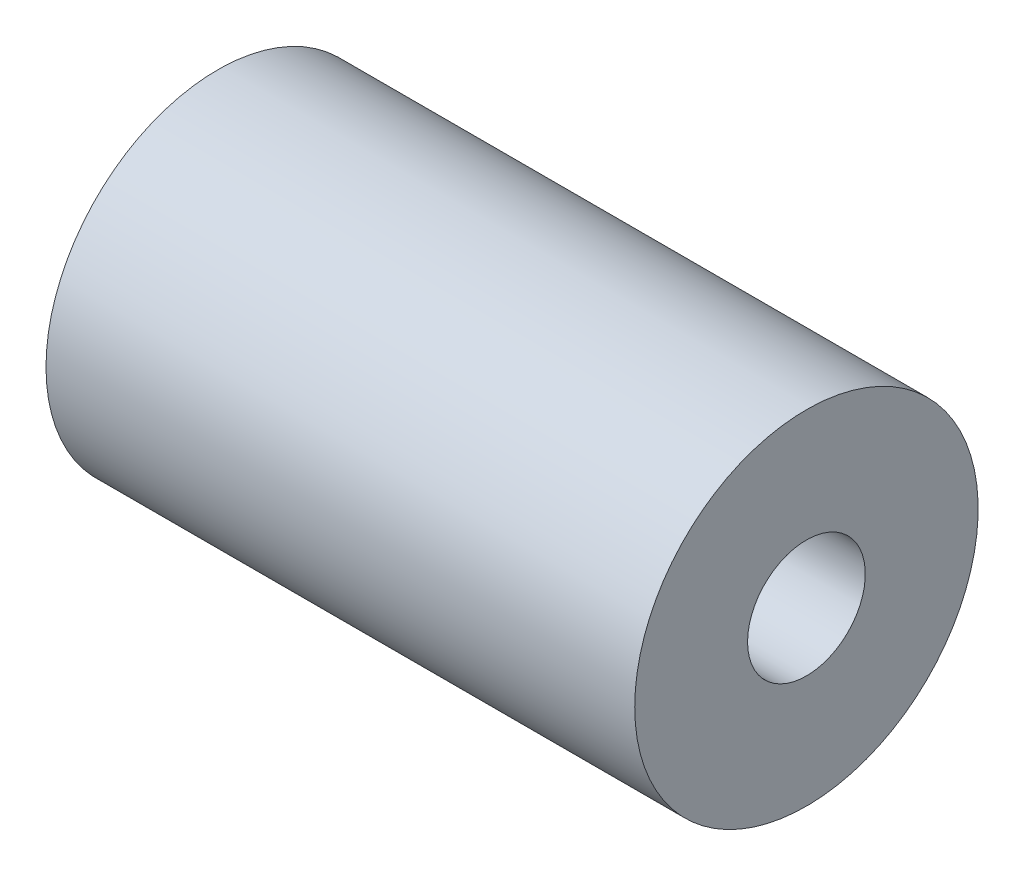
ISO-10303-21;
HEADER;
FILE_DESCRIPTION(('STEP AP214'),'2;1');
FILE_NAME('part.step','',(''),(''),'','','');
FILE_SCHEMA(('AUTOMOTIVE_DESIGN { 1 0 10303 214 1 1 1 1 }'));
ENDSEC;
DATA;
#1=APPLICATION_CONTEXT('core data for automotive mechanical design processes');
#2=APPLICATION_PROTOCOL_DEFINITION('international standard','automotive_design',2000,#1);
#3=PRODUCT_CONTEXT('',#1,'mechanical');
#4=PRODUCT('Part','Part','',(#3));
#5=PRODUCT_RELATED_PRODUCT_CATEGORY('part','',(#4));
#6=PRODUCT_DEFINITION_FORMATION('','',#4);
#7=PRODUCT_DEFINITION_CONTEXT('part definition',#1,'design');
#8=PRODUCT_DEFINITION('design','',#6,#7);
#9=PRODUCT_DEFINITION_SHAPE('','',#8);
#10=(LENGTH_UNIT() NAMED_UNIT(*) SI_UNIT(.MILLI.,.METRE.));
#11=(NAMED_UNIT(*) PLANE_ANGLE_UNIT() SI_UNIT($,.RADIAN.));
#12=(NAMED_UNIT(*) SI_UNIT($,.STERADIAN.) SOLID_ANGLE_UNIT());
#13=UNCERTAINTY_MEASURE_WITH_UNIT(LENGTH_MEASURE(1.E-05),#10,'distance_accuracy_value','');
#14=(GEOMETRIC_REPRESENTATION_CONTEXT(3) GLOBAL_UNCERTAINTY_ASSIGNED_CONTEXT((#13)) GLOBAL_UNIT_ASSIGNED_CONTEXT((#10,
#11,#12)) REPRESENTATION_CONTEXT('',''));
#15=CARTESIAN_POINT('',(0.,0.,0.));
#16=DIRECTION('',(0.,0.,1.));
#17=DIRECTION('',(1.,0.,0.));
#18=AXIS2_PLACEMENT_3D('',#15,#16,#17);
#19=CARTESIAN_POINT('',(73.,7.,0.));
#20=DIRECTION('',(1.,0.,0.));
#21=DIRECTION('',(0.,0.,-1.));
#22=AXIS2_PLACEMENT_3D('',#19,#20,#21);
#23=PLANE('',#22);
#24=CARTESIAN_POINT('',(73.,0.,0.));
#25=DIRECTION('',(-1.,0.,0.));
#26=DIRECTION('',(0.,0.,1.));
#27=AXIS2_PLACEMENT_3D('',#24,#25,#26);
#28=CIRCLE('',#27,2.4);
#29=CARTESIAN_POINT('',(73.,0.,2.4));
#30=VERTEX_POINT('',#29);
#31=EDGE_CURVE('E10',#30,#30,#28,.T.);
#32=ORIENTED_EDGE('',*,*,#31,.F.);
#33=EDGE_LOOP('',(#32));
#34=FACE_BOUND('',#33,.T.);
#35=CARTESIAN_POINT('',(73.,0.,0.));
#36=DIRECTION('',(-1.,0.,0.));
#37=DIRECTION('',(0.,0.,1.));
#38=AXIS2_PLACEMENT_3D('',#35,#36,#37);
#39=CIRCLE('',#38,7.);
#40=CARTESIAN_POINT('',(73.,0.,7.));
#41=VERTEX_POINT('',#40);
#42=EDGE_CURVE('E45',#41,#41,#39,.T.);
#43=ORIENTED_EDGE('',*,*,#42,.T.);
#44=EDGE_LOOP('',(#43));
#45=FACE_BOUND('',#44,.T.);
#46=ADVANCED_FACE('F31',(#34,#45),#23,.F.);
#47=CARTESIAN_POINT('',(-110.,0.,0.));
#48=DIRECTION('',(-1.,0.,0.));
#49=DIRECTION('',(0.,0.,1.));
#50=AXIS2_PLACEMENT_3D('',#47,#48,#49);
#51=CYLINDRICAL_SURFACE('',#50,2.4);
#52=CARTESIAN_POINT('',(97.,0.,0.));
#53=DIRECTION('',(-1.,0.,0.));
#54=DIRECTION('',(0.,0.,1.));
#55=AXIS2_PLACEMENT_3D('',#52,#53,#54);
#56=CIRCLE('',#55,2.4);
#57=CARTESIAN_POINT('',(97.,0.,2.4));
#58=VERTEX_POINT('',#57);
#59=EDGE_CURVE('E37',#58,#58,#56,.T.);
#60=ORIENTED_EDGE('',*,*,#59,.F.);
#61=EDGE_LOOP('',(#60));
#62=FACE_BOUND('',#61,.T.);
#63=ORIENTED_EDGE('',*,*,#31,.T.);
#64=EDGE_LOOP('',(#63));
#65=FACE_BOUND('',#64,.T.);
#66=ADVANCED_FACE('F60',(#62,#65),#51,.F.);
#67=CARTESIAN_POINT('',(97.,2.4,0.));
#68=DIRECTION('',(-1.,0.,0.));
#69=DIRECTION('',(0.,0.,1.));
#70=AXIS2_PLACEMENT_3D('',#67,#68,#69);
#71=PLANE('',#70);
#72=CARTESIAN_POINT('',(97.,0.,0.));
#73=DIRECTION('',(-1.,0.,0.));
#74=DIRECTION('',(0.,0.,1.));
#75=AXIS2_PLACEMENT_3D('',#72,#73,#74);
#76=CIRCLE('',#75,7.);
#77=CARTESIAN_POINT('',(97.,0.,7.));
#78=VERTEX_POINT('',#77);
#79=EDGE_CURVE('E41',#78,#78,#76,.T.);
#80=ORIENTED_EDGE('',*,*,#79,.F.);
#81=EDGE_LOOP('',(#80));
#82=FACE_BOUND('',#81,.T.);
#83=ORIENTED_EDGE('',*,*,#59,.T.);
#84=EDGE_LOOP('',(#83));
#85=FACE_BOUND('',#84,.T.);
#86=ADVANCED_FACE('F55',(#82,#85),#71,.F.);
#87=CARTESIAN_POINT('',(-110.,0.,0.));
#88=DIRECTION('',(-1.,0.,0.));
#89=DIRECTION('',(0.,0.,1.));
#90=AXIS2_PLACEMENT_3D('',#87,#88,#89);
#91=CYLINDRICAL_SURFACE('',#90,7.);
#92=ORIENTED_EDGE('',*,*,#42,.F.);
#93=EDGE_LOOP('',(#92));
#94=FACE_BOUND('',#93,.T.);
#95=ORIENTED_EDGE('',*,*,#79,.T.);
#96=EDGE_LOOP('',(#95));
#97=FACE_BOUND('',#96,.T.);
#98=ADVANCED_FACE('F52',(#94,#97),#91,.T.);
#99=CLOSED_SHELL('',(#46,#66,#86,#98));
#100=MANIFOLD_SOLID_BREP('B2',#99);
#101=ADVANCED_BREP_SHAPE_REPRESENTATION('',(#18,#100),#14);
#102=SHAPE_DEFINITION_REPRESENTATION(#9,#101);
ENDSEC;
END-ISO-10303-21;
